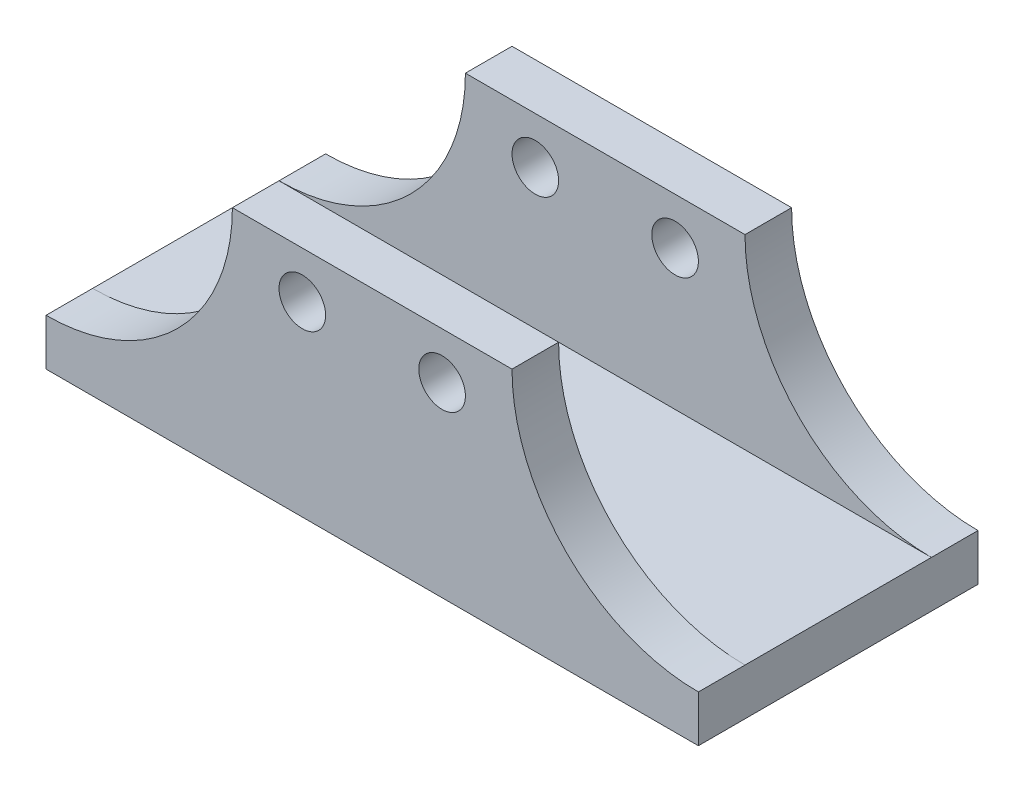
ISO-10303-21;
HEADER;
FILE_DESCRIPTION(('STEP AP214'),'2;1');
FILE_NAME('part.step','',(''),(''),'','','');
FILE_SCHEMA(('AUTOMOTIVE_DESIGN { 1 0 10303 214 1 1 1 1 }'));
ENDSEC;
DATA;
#1=APPLICATION_CONTEXT('core data for automotive mechanical design processes');
#2=APPLICATION_PROTOCOL_DEFINITION('international standard','automotive_design',2000,#1);
#3=PRODUCT_CONTEXT('',#1,'mechanical');
#4=PRODUCT('Part','Part','',(#3));
#5=PRODUCT_RELATED_PRODUCT_CATEGORY('part','',(#4));
#6=PRODUCT_DEFINITION_FORMATION('','',#4);
#7=PRODUCT_DEFINITION_CONTEXT('part definition',#1,'design');
#8=PRODUCT_DEFINITION('design','',#6,#7);
#9=PRODUCT_DEFINITION_SHAPE('','',#8);
#10=(LENGTH_UNIT() NAMED_UNIT(*) SI_UNIT(.MILLI.,.METRE.));
#11=(NAMED_UNIT(*) PLANE_ANGLE_UNIT() SI_UNIT($,.RADIAN.));
#12=(NAMED_UNIT(*) SI_UNIT($,.STERADIAN.) SOLID_ANGLE_UNIT());
#13=UNCERTAINTY_MEASURE_WITH_UNIT(LENGTH_MEASURE(1.E-05),#10,'distance_accuracy_value','');
#14=(GEOMETRIC_REPRESENTATION_CONTEXT(3) GLOBAL_UNCERTAINTY_ASSIGNED_CONTEXT((#13)) GLOBAL_UNIT_ASSIGNED_CONTEXT((#10,
#11,#12)) REPRESENTATION_CONTEXT('',''));
#15=CARTESIAN_POINT('',(0.,0.,0.));
#16=DIRECTION('',(0.,0.,1.));
#17=DIRECTION('',(1.,0.,0.));
#18=AXIS2_PLACEMENT_3D('',#15,#16,#17);
#19=CARTESIAN_POINT('',(-49.1371523651057,43.9225101022106,10.));
#20=DIRECTION('',(0.,0.,1.));
#21=DIRECTION('',(1.,0.,0.));
#22=AXIS2_PLACEMENT_3D('',#19,#20,#21);
#23=PLANE('',#22);
#24=DIRECTION('',(-1.,0.,0.));
#25=VECTOR('',#24,1.);
#26=CARTESIAN_POINT('',(-49.1371523651053,3.9225101022106,10.));
#27=LINE('',#26,#25);
#28=CARTESIAN_POINT('',(90.8628476348943,3.9225101022106,10.));
#29=VERTEX_POINT('',#28);
#30=CARTESIAN_POINT('',(-49.1371523651053,3.9225101022106,10.));
#31=VERTEX_POINT('',#30);
#32=EDGE_CURVE('E83',#29,#31,#27,.T.);
#33=ORIENTED_EDGE('',*,*,#32,.F.);
#34=CARTESIAN_POINT('',(90.8628476348943,43.9225101022106,10.));
#35=DIRECTION('',(0.,0.,-1.));
#36=DIRECTION('',(1.,0.,0.));
#37=AXIS2_PLACEMENT_3D('',#34,#35,#36);
#38=CIRCLE('',#37,40.);
#39=CARTESIAN_POINT('',(50.8628476348943,43.9225101022106,10.));
#40=VERTEX_POINT('',#39);
#41=EDGE_CURVE('E178',#29,#40,#38,.T.);
#42=ORIENTED_EDGE('',*,*,#41,.T.);
#43=DIRECTION('',(-1.,0.,0.));
#44=VECTOR('',#43,1.);
#45=CARTESIAN_POINT('',(-9.13715236510574,43.9225101022106,10.));
#46=LINE('',#45,#44);
#47=CARTESIAN_POINT('',(-9.13715236510574,43.9225101022106,10.));
#48=VERTEX_POINT('',#47);
#49=EDGE_CURVE('E50',#40,#48,#46,.T.);
#50=ORIENTED_EDGE('',*,*,#49,.T.);
#51=CARTESIAN_POINT('',(-49.1371523651057,43.9225101022106,10.));
#52=DIRECTION('',(0.,0.,-1.));
#53=DIRECTION('',(1.,0.,0.));
#54=AXIS2_PLACEMENT_3D('',#51,#52,#53);
#55=CIRCLE('',#54,40.);
#56=EDGE_CURVE('E176',#48,#31,#55,.T.);
#57=ORIENTED_EDGE('',*,*,#56,.T.);
#58=EDGE_LOOP('',(#33,#42,#50,#57));
#59=FACE_BOUND('',#58,.T.);
#60=CARTESIAN_POINT('',(5.86284763489426,33.9225101022106,10.));
#61=DIRECTION('',(0.,0.,1.));
#62=DIRECTION('',(1.,0.,0.));
#63=AXIS2_PLACEMENT_3D('',#60,#61,#62);
#64=CIRCLE('',#63,5.);
#65=CARTESIAN_POINT('',(10.8628476348943,33.9225101022106,10.));
#66=VERTEX_POINT('',#65);
#67=EDGE_CURVE('E170',#66,#66,#64,.T.);
#68=ORIENTED_EDGE('',*,*,#67,.F.);
#69=EDGE_LOOP('',(#68));
#70=FACE_BOUND('',#69,.T.);
#71=CARTESIAN_POINT('',(35.8628476348943,33.9225101022106,10.));
#72=DIRECTION('',(0.,0.,1.));
#73=DIRECTION('',(1.,0.,0.));
#74=AXIS2_PLACEMENT_3D('',#71,#72,#73);
#75=CIRCLE('',#74,5.);
#76=CARTESIAN_POINT('',(40.8628476348943,33.9225101022106,10.));
#77=VERTEX_POINT('',#76);
#78=EDGE_CURVE('E164',#77,#77,#75,.T.);
#79=ORIENTED_EDGE('',*,*,#78,.F.);
#80=EDGE_LOOP('',(#79));
#81=FACE_BOUND('',#80,.T.);
#82=ADVANCED_FACE('F33',(#59,#70,#81),#23,.T.);
#83=CARTESIAN_POINT('',(-49.1371523651057,43.9225101022106,0.));
#84=DIRECTION('',(0.,0.,1.));
#85=DIRECTION('',(1.,0.,0.));
#86=AXIS2_PLACEMENT_3D('',#83,#84,#85);
#87=PLANE('',#86);
#88=CARTESIAN_POINT('',(-49.1371523651057,43.9225101022106,0.));
#89=DIRECTION('',(0.,0.,-1.));
#90=DIRECTION('',(1.,0.,0.));
#91=AXIS2_PLACEMENT_3D('',#88,#89,#90);
#92=CIRCLE('',#91,40.);
#93=CARTESIAN_POINT('',(-9.13715236510574,43.9225101022106,0.));
#94=VERTEX_POINT('',#93);
#95=CARTESIAN_POINT('',(-49.1371523651057,3.9225101022106,0.));
#96=VERTEX_POINT('',#95);
#97=EDGE_CURVE('E173',#94,#96,#92,.T.);
#98=ORIENTED_EDGE('',*,*,#97,.F.);
#99=DIRECTION('',(-1.,0.,0.));
#100=VECTOR('',#99,1.);
#101=CARTESIAN_POINT('',(-9.13715236510574,43.9225101022106,0.));
#102=LINE('',#101,#100);
#103=CARTESIAN_POINT('',(50.8628476348943,43.9225101022106,0.));
#104=VERTEX_POINT('',#103);
#105=EDGE_CURVE('E79',#104,#94,#102,.T.);
#106=ORIENTED_EDGE('',*,*,#105,.F.);
#107=CARTESIAN_POINT('',(90.8628476348943,43.9225101022106,0.));
#108=DIRECTION('',(0.,0.,-1.));
#109=DIRECTION('',(1.,0.,0.));
#110=AXIS2_PLACEMENT_3D('',#107,#108,#109);
#111=CIRCLE('',#110,40.);
#112=CARTESIAN_POINT('',(90.8628476348943,3.9225101022106,0.));
#113=VERTEX_POINT('',#112);
#114=EDGE_CURVE('E74',#113,#104,#111,.T.);
#115=ORIENTED_EDGE('',*,*,#114,.F.);
#116=DIRECTION('',(0.,1.,0.));
#117=VECTOR('',#116,1.);
#118=CARTESIAN_POINT('',(90.8628476348943,-6.0774898977894,0.));
#119=LINE('',#118,#117);
#120=CARTESIAN_POINT('',(90.8628476348943,-6.0774898977894,0.));
#121=VERTEX_POINT('',#120);
#122=EDGE_CURVE('E188',#121,#113,#119,.T.);
#123=ORIENTED_EDGE('',*,*,#122,.F.);
#124=DIRECTION('',(1.,0.,0.));
#125=VECTOR('',#124,1.);
#126=CARTESIAN_POINT('',(-49.1371523651057,-6.0774898977894,0.));
#127=LINE('',#126,#125);
#128=CARTESIAN_POINT('',(-49.1371523651057,-6.0774898977894,0.));
#129=VERTEX_POINT('',#128);
#130=EDGE_CURVE('E186',#129,#121,#127,.T.);
#131=ORIENTED_EDGE('',*,*,#130,.F.);
#132=DIRECTION('',(0.,-1.,0.));
#133=VECTOR('',#132,1.);
#134=CARTESIAN_POINT('',(-49.1371523651057,3.9225101022106,0.));
#135=LINE('',#134,#133);
#136=EDGE_CURVE('E184',#96,#129,#135,.T.);
#137=ORIENTED_EDGE('',*,*,#136,.F.);
#138=EDGE_LOOP('',(#98,#106,#115,#123,#131,#137));
#139=FACE_BOUND('',#138,.T.);
#140=CARTESIAN_POINT('',(5.86284763489426,33.9225101022106,0.));
#141=DIRECTION('',(0.,0.,1.));
#142=DIRECTION('',(1.,0.,0.));
#143=AXIS2_PLACEMENT_3D('',#140,#141,#142);
#144=CIRCLE('',#143,5.);
#145=CARTESIAN_POINT('',(10.8628476348943,33.9225101022106,0.));
#146=VERTEX_POINT('',#145);
#147=EDGE_CURVE('E167',#146,#146,#144,.T.);
#148=ORIENTED_EDGE('',*,*,#147,.T.);
#149=EDGE_LOOP('',(#148));
#150=FACE_BOUND('',#149,.T.);
#151=CARTESIAN_POINT('',(35.8628476348943,33.9225101022106,0.));
#152=DIRECTION('',(0.,0.,1.));
#153=DIRECTION('',(1.,0.,0.));
#154=AXIS2_PLACEMENT_3D('',#151,#152,#153);
#155=CIRCLE('',#154,5.);
#156=CARTESIAN_POINT('',(40.8628476348943,33.9225101022106,0.));
#157=VERTEX_POINT('',#156);
#158=EDGE_CURVE('E163',#157,#157,#155,.T.);
#159=ORIENTED_EDGE('',*,*,#158,.T.);
#160=EDGE_LOOP('',(#159));
#161=FACE_BOUND('',#160,.T.);
#162=ADVANCED_FACE('F205',(#139,#150,#161),#87,.F.);
#163=CARTESIAN_POINT('',(-49.1371523651057,43.9225101022106,10.));
#164=DIRECTION('',(0.,0.,-1.));
#165=DIRECTION('',(-1.,0.,0.));
#166=AXIS2_PLACEMENT_3D('',#163,#164,#165);
#167=CYLINDRICAL_SURFACE('',#166,40.);
#168=ORIENTED_EDGE('',*,*,#97,.T.);
#169=DIRECTION('',(0.,0.,-1.));
#170=VECTOR('',#169,1.);
#171=CARTESIAN_POINT('',(-49.1371523651057,3.9225101022106,10.));
#172=LINE('',#171,#170);
#173=EDGE_CURVE('E11',#31,#96,#172,.T.);
#174=ORIENTED_EDGE('',*,*,#173,.F.);
#175=ORIENTED_EDGE('',*,*,#56,.F.);
#176=DIRECTION('',(0.,0.,-1.));
#177=VECTOR('',#176,1.);
#178=CARTESIAN_POINT('',(-9.13715236510574,43.9225101022106,10.));
#179=LINE('',#178,#177);
#180=EDGE_CURVE('E181',#48,#94,#179,.T.);
#181=ORIENTED_EDGE('',*,*,#180,.T.);
#182=EDGE_LOOP('',(#168,#174,#175,#181));
#183=FACE_BOUND('',#182,.T.);
#184=ADVANCED_FACE('F35',(#183),#167,.F.);
#185=CARTESIAN_POINT('',(-49.1371523651057,3.9225101022106,10.));
#186=DIRECTION('',(1.,0.,0.));
#187=DIRECTION('',(0.,0.,-1.));
#188=AXIS2_PLACEMENT_3D('',#185,#186,#187);
#189=PLANE('',#188);
#190=ORIENTED_EDGE('',*,*,#136,.T.);
#191=DIRECTION('',(0.,0.,-1.));
#192=VECTOR('',#191,1.);
#193=CARTESIAN_POINT('',(-49.1371523651057,-6.0774898977894,10.));
#194=LINE('',#193,#192);
#195=CARTESIAN_POINT('',(-49.1371523651057,-6.0774898977894,60.));
#196=VERTEX_POINT('',#195);
#197=EDGE_CURVE('E42',#196,#129,#194,.T.);
#198=ORIENTED_EDGE('',*,*,#197,.F.);
#199=DIRECTION('',(0.,-1.,0.));
#200=VECTOR('',#199,1.);
#201=CARTESIAN_POINT('',(-49.1371523651053,3.9225101022106,60.));
#202=LINE('',#201,#200);
#203=CARTESIAN_POINT('',(-49.1371523651053,3.9225101022106,60.));
#204=VERTEX_POINT('',#203);
#205=EDGE_CURVE('E120',#204,#196,#202,.T.);
#206=ORIENTED_EDGE('',*,*,#205,.F.);
#207=DIRECTION('',(0.,0.,-1.));
#208=VECTOR('',#207,1.);
#209=CARTESIAN_POINT('',(-49.1371523651053,3.9225101022106,60.));
#210=LINE('',#209,#208);
#211=CARTESIAN_POINT('',(-49.1371523651053,3.9225101022106,50.));
#212=VERTEX_POINT('',#211);
#213=EDGE_CURVE('E125',#204,#212,#210,.T.);
#214=ORIENTED_EDGE('',*,*,#213,.T.);
#215=DIRECTION('',(0.,0.,-1.));
#216=VECTOR('',#215,1.);
#217=CARTESIAN_POINT('',(-49.1371523651053,3.9225101022106,50.));
#218=LINE('',#217,#216);
#219=EDGE_CURVE('E157',#212,#31,#218,.T.);
#220=ORIENTED_EDGE('',*,*,#219,.T.);
#221=ORIENTED_EDGE('',*,*,#173,.T.);
#222=EDGE_LOOP('',(#190,#198,#206,#214,#220,#221));
#223=FACE_BOUND('',#222,.T.);
#224=ADVANCED_FACE('F122',(#223),#189,.F.);
#225=CARTESIAN_POINT('',(-49.1371523651057,-6.0774898977894,10.));
#226=DIRECTION('',(0.,1.,0.));
#227=DIRECTION('',(0.,0.,1.));
#228=AXIS2_PLACEMENT_3D('',#225,#226,#227);
#229=PLANE('',#228);
#230=CARTESIAN_POINT('',(20.8628476348943,-6.0774898977894,30.));
#231=DIRECTION('',(0.,1.,0.));
#232=DIRECTION('',(0.,0.,1.));
#233=AXIS2_PLACEMENT_3D('',#230,#231,#232);
#234=CIRCLE('',#233,5.);
#235=CARTESIAN_POINT('',(20.8628476348943,-6.0774898977894,35.));
#236=VERTEX_POINT('',#235);
#237=EDGE_CURVE('E441',#236,#236,#234,.T.);
#238=ORIENTED_EDGE('',*,*,#237,.T.);
#239=EDGE_LOOP('',(#238));
#240=FACE_BOUND('',#239,.T.);
#241=ORIENTED_EDGE('',*,*,#130,.T.);
#242=DIRECTION('',(0.,0.,-1.));
#243=VECTOR('',#242,1.);
#244=CARTESIAN_POINT('',(90.8628476348943,-6.0774898977894,10.));
#245=LINE('',#244,#243);
#246=CARTESIAN_POINT('',(90.8628476348943,-6.0774898977894,60.));
#247=VERTEX_POINT('',#246);
#248=EDGE_CURVE('E197',#247,#121,#245,.T.);
#249=ORIENTED_EDGE('',*,*,#248,.F.);
#250=DIRECTION('',(1.,0.,0.));
#251=VECTOR('',#250,1.);
#252=CARTESIAN_POINT('',(-49.1371523651057,-6.0774898977894,60.));
#253=LINE('',#252,#251);
#254=EDGE_CURVE('E131',#196,#247,#253,.T.);
#255=ORIENTED_EDGE('',*,*,#254,.F.);
#256=ORIENTED_EDGE('',*,*,#197,.T.);
#257=EDGE_LOOP('',(#241,#249,#255,#256));
#258=FACE_BOUND('',#257,.T.);
#259=ADVANCED_FACE('F201',(#240,#258),#229,.F.);
#260=CARTESIAN_POINT('',(90.8628476348943,-6.0774898977894,10.));
#261=DIRECTION('',(-1.,0.,0.));
#262=DIRECTION('',(0.,0.,1.));
#263=AXIS2_PLACEMENT_3D('',#260,#261,#262);
#264=PLANE('',#263);
#265=ORIENTED_EDGE('',*,*,#122,.T.);
#266=DIRECTION('',(0.,0.,-1.));
#267=VECTOR('',#266,1.);
#268=CARTESIAN_POINT('',(90.8628476348943,3.9225101022106,10.));
#269=LINE('',#268,#267);
#270=EDGE_CURVE('E195',#29,#113,#269,.T.);
#271=ORIENTED_EDGE('',*,*,#270,.F.);
#272=DIRECTION('',(0.,0.,-1.));
#273=VECTOR('',#272,1.);
#274=CARTESIAN_POINT('',(90.8628476348943,3.9225101022106,50.));
#275=LINE('',#274,#273);
#276=CARTESIAN_POINT('',(90.8628476348943,3.9225101022106,50.));
#277=VERTEX_POINT('',#276);
#278=EDGE_CURVE('E160',#277,#29,#275,.T.);
#279=ORIENTED_EDGE('',*,*,#278,.F.);
#280=DIRECTION('',(0.,0.,-1.));
#281=VECTOR('',#280,1.);
#282=CARTESIAN_POINT('',(90.8628476348943,3.9225101022106,60.));
#283=LINE('',#282,#281);
#284=CARTESIAN_POINT('',(90.8628476348943,3.9225101022106,60.));
#285=VERTEX_POINT('',#284);
#286=EDGE_CURVE('E147',#285,#277,#283,.T.);
#287=ORIENTED_EDGE('',*,*,#286,.F.);
#288=DIRECTION('',(0.,1.,0.));
#289=VECTOR('',#288,1.);
#290=CARTESIAN_POINT('',(90.8628476348943,-6.0774898977894,60.));
#291=LINE('',#290,#289);
#292=EDGE_CURVE('E217',#247,#285,#291,.T.);
#293=ORIENTED_EDGE('',*,*,#292,.F.);
#294=ORIENTED_EDGE('',*,*,#248,.T.);
#295=EDGE_LOOP('',(#265,#271,#279,#287,#293,#294));
#296=FACE_BOUND('',#295,.T.);
#297=ADVANCED_FACE('F208',(#296),#264,.F.);
#298=CARTESIAN_POINT('',(90.8628476348943,43.9225101022106,10.));
#299=DIRECTION('',(0.,0.,-1.));
#300=DIRECTION('',(-1.,0.,0.));
#301=AXIS2_PLACEMENT_3D('',#298,#299,#300);
#302=CYLINDRICAL_SURFACE('',#301,40.);
#303=ORIENTED_EDGE('',*,*,#114,.T.);
#304=DIRECTION('',(0.,0.,-1.));
#305=VECTOR('',#304,1.);
#306=CARTESIAN_POINT('',(50.8628476348943,43.9225101022106,10.));
#307=LINE('',#306,#305);
#308=EDGE_CURVE('E193',#40,#104,#307,.T.);
#309=ORIENTED_EDGE('',*,*,#308,.F.);
#310=ORIENTED_EDGE('',*,*,#41,.F.);
#311=ORIENTED_EDGE('',*,*,#270,.T.);
#312=EDGE_LOOP('',(#303,#309,#310,#311));
#313=FACE_BOUND('',#312,.T.);
#314=ADVANCED_FACE('F211',(#313),#302,.F.);
#315=CARTESIAN_POINT('',(-9.13715236510574,43.9225101022106,10.));
#316=DIRECTION('',(0.,-1.,0.));
#317=DIRECTION('',(0.,0.,-1.));
#318=AXIS2_PLACEMENT_3D('',#315,#316,#317);
#319=PLANE('',#318);
#320=ORIENTED_EDGE('',*,*,#105,.T.);
#321=ORIENTED_EDGE('',*,*,#180,.F.);
#322=ORIENTED_EDGE('',*,*,#49,.F.);
#323=ORIENTED_EDGE('',*,*,#308,.T.);
#324=EDGE_LOOP('',(#320,#321,#322,#323));
#325=FACE_BOUND('',#324,.T.);
#326=ADVANCED_FACE('F267',(#325),#319,.F.);
#327=CARTESIAN_POINT('',(5.86284763489426,33.9225101022106,10.));
#328=DIRECTION('',(0.,0.,-1.));
#329=DIRECTION('',(-1.,0.,0.));
#330=AXIS2_PLACEMENT_3D('',#327,#328,#329);
#331=CYLINDRICAL_SURFACE('',#330,5.);
#332=ORIENTED_EDGE('',*,*,#67,.T.);
#333=EDGE_LOOP('',(#332));
#334=FACE_BOUND('',#333,.T.);
#335=ORIENTED_EDGE('',*,*,#147,.F.);
#336=EDGE_LOOP('',(#335));
#337=FACE_BOUND('',#336,.T.);
#338=ADVANCED_FACE('F264',(#334,#337),#331,.F.);
#339=CARTESIAN_POINT('',(35.8628476348943,33.9225101022106,10.));
#340=DIRECTION('',(0.,0.,-1.));
#341=DIRECTION('',(-1.,0.,0.));
#342=AXIS2_PLACEMENT_3D('',#339,#340,#341);
#343=CYLINDRICAL_SURFACE('',#342,5.);
#344=ORIENTED_EDGE('',*,*,#78,.T.);
#345=EDGE_LOOP('',(#344));
#346=FACE_BOUND('',#345,.T.);
#347=ORIENTED_EDGE('',*,*,#158,.F.);
#348=EDGE_LOOP('',(#347));
#349=FACE_BOUND('',#348,.T.);
#350=ADVANCED_FACE('F250',(#346,#349),#343,.F.);
#351=CARTESIAN_POINT('',(-49.1371523651053,3.9225101022106,50.));
#352=DIRECTION('',(0.,-1.,0.));
#353=DIRECTION('',(0.,0.,-1.));
#354=AXIS2_PLACEMENT_3D('',#351,#352,#353);
#355=PLANE('',#354);
#356=CARTESIAN_POINT('',(20.8628476348943,3.9225101022106,30.));
#357=DIRECTION('',(0.,1.,0.));
#358=DIRECTION('',(0.,0.,1.));
#359=AXIS2_PLACEMENT_3D('',#356,#357,#358);
#360=CIRCLE('',#359,5.);
#361=CARTESIAN_POINT('',(20.8628476348943,3.9225101022106,35.));
#362=VERTEX_POINT('',#361);
#363=EDGE_CURVE('E443',#362,#362,#360,.T.);
#364=ORIENTED_EDGE('',*,*,#363,.F.);
#365=EDGE_LOOP('',(#364));
#366=FACE_BOUND('',#365,.T.);
#367=ORIENTED_EDGE('',*,*,#32,.T.);
#368=ORIENTED_EDGE('',*,*,#219,.F.);
#369=DIRECTION('',(-1.,0.,0.));
#370=VECTOR('',#369,1.);
#371=CARTESIAN_POINT('',(-49.1371523651053,3.9225101022106,50.));
#372=LINE('',#371,#370);
#373=EDGE_CURVE('E149',#277,#212,#372,.T.);
#374=ORIENTED_EDGE('',*,*,#373,.F.);
#375=ORIENTED_EDGE('',*,*,#278,.T.);
#376=EDGE_LOOP('',(#367,#368,#374,#375));
#377=FACE_BOUND('',#376,.T.);
#378=ADVANCED_FACE('F214',(#366,#377),#355,.F.);
#379=CARTESIAN_POINT('',(-49.1371523651053,43.9225101022106,50.));
#380=DIRECTION('',(0.,0.,1.));
#381=DIRECTION('',(1.,0.,0.));
#382=AXIS2_PLACEMENT_3D('',#379,#380,#381);
#383=PLANE('',#382);
#384=CARTESIAN_POINT('',(5.86284763489426,33.9225101022106,50.));
#385=DIRECTION('',(0.,0.,1.));
#386=DIRECTION('',(1.,0.,0.));
#387=AXIS2_PLACEMENT_3D('',#384,#385,#386);
#388=CIRCLE('',#387,5.);
#389=CARTESIAN_POINT('',(10.8628476348943,33.9225101022106,50.));
#390=VERTEX_POINT('',#389);
#391=EDGE_CURVE('E432',#390,#390,#388,.T.);
#392=ORIENTED_EDGE('',*,*,#391,.T.);
#393=EDGE_LOOP('',(#392));
#394=FACE_BOUND('',#393,.T.);
#395=CARTESIAN_POINT('',(35.8628476348943,33.9225101022106,50.));
#396=DIRECTION('',(0.,0.,1.));
#397=DIRECTION('',(1.,0.,0.));
#398=AXIS2_PLACEMENT_3D('',#395,#396,#397);
#399=CIRCLE('',#398,5.);
#400=CARTESIAN_POINT('',(40.8628476348943,33.9225101022106,50.));
#401=VERTEX_POINT('',#400);
#402=EDGE_CURVE('E437',#401,#401,#399,.T.);
#403=ORIENTED_EDGE('',*,*,#402,.T.);
#404=EDGE_LOOP('',(#403));
#405=FACE_BOUND('',#404,.T.);
#406=CARTESIAN_POINT('',(90.8628476348943,43.9225101022106,50.));
#407=DIRECTION('',(0.,0.,-1.));
#408=DIRECTION('',(1.,0.,0.));
#409=AXIS2_PLACEMENT_3D('',#406,#407,#408);
#410=CIRCLE('',#409,40.);
#411=CARTESIAN_POINT('',(50.8628476348943,43.9225101022106,50.));
#412=VERTEX_POINT('',#411);
#413=EDGE_CURVE('E231',#277,#412,#410,.T.);
#414=ORIENTED_EDGE('',*,*,#413,.F.);
#415=ORIENTED_EDGE('',*,*,#373,.T.);
#416=CARTESIAN_POINT('',(-49.1371523651053,43.9225101022106,50.));
#417=DIRECTION('',(0.,0.,-1.));
#418=DIRECTION('',(1.,0.,0.));
#419=AXIS2_PLACEMENT_3D('',#416,#417,#418);
#420=CIRCLE('',#419,40.);
#421=CARTESIAN_POINT('',(-9.13715236510532,43.9225101022106,50.));
#422=VERTEX_POINT('',#421);
#423=EDGE_CURVE('E146',#422,#212,#420,.T.);
#424=ORIENTED_EDGE('',*,*,#423,.F.);
#425=DIRECTION('',(-1.,0.,0.));
#426=VECTOR('',#425,1.);
#427=CARTESIAN_POINT('',(-9.13715236510532,43.9225101022106,50.));
#428=LINE('',#427,#426);
#429=EDGE_CURVE('E142',#412,#422,#428,.T.);
#430=ORIENTED_EDGE('',*,*,#429,.F.);
#431=EDGE_LOOP('',(#414,#415,#424,#430));
#432=FACE_BOUND('',#431,.T.);
#433=ADVANCED_FACE('F239',(#394,#405,#432),#383,.F.);
#434=CARTESIAN_POINT('',(-49.1371523651053,43.9225101022106,60.));
#435=DIRECTION('',(0.,0.,1.));
#436=DIRECTION('',(1.,0.,0.));
#437=AXIS2_PLACEMENT_3D('',#434,#435,#436);
#438=PLANE('',#437);
#439=CARTESIAN_POINT('',(5.86284763489426,33.9225101022106,60.));
#440=DIRECTION('',(0.,0.,1.));
#441=DIRECTION('',(1.,0.,0.));
#442=AXIS2_PLACEMENT_3D('',#439,#440,#441);
#443=CIRCLE('',#442,5.);
#444=CARTESIAN_POINT('',(10.8628476348943,33.9225101022106,60.));
#445=VERTEX_POINT('',#444);
#446=EDGE_CURVE('E232',#445,#445,#443,.T.);
#447=ORIENTED_EDGE('',*,*,#446,.F.);
#448=EDGE_LOOP('',(#447));
#449=FACE_BOUND('',#448,.T.);
#450=CARTESIAN_POINT('',(-49.1371523651053,43.9225101022106,60.));
#451=DIRECTION('',(0.,0.,-1.));
#452=DIRECTION('',(1.,0.,0.));
#453=AXIS2_PLACEMENT_3D('',#450,#451,#452);
#454=CIRCLE('',#453,40.);
#455=CARTESIAN_POINT('',(-9.13715236510532,43.9225101022106,60.));
#456=VERTEX_POINT('',#455);
#457=EDGE_CURVE('E132',#456,#204,#454,.T.);
#458=ORIENTED_EDGE('',*,*,#457,.T.);
#459=ORIENTED_EDGE('',*,*,#205,.T.);
#460=ORIENTED_EDGE('',*,*,#254,.T.);
#461=ORIENTED_EDGE('',*,*,#292,.T.);
#462=CARTESIAN_POINT('',(90.8628476348943,43.9225101022106,60.));
#463=DIRECTION('',(0.,0.,-1.));
#464=DIRECTION('',(1.,0.,0.));
#465=AXIS2_PLACEMENT_3D('',#462,#463,#464);
#466=CIRCLE('',#465,40.);
#467=CARTESIAN_POINT('',(50.8628476348943,43.9225101022106,60.));
#468=VERTEX_POINT('',#467);
#469=EDGE_CURVE('E221',#285,#468,#466,.T.);
#470=ORIENTED_EDGE('',*,*,#469,.T.);
#471=DIRECTION('',(-1.,0.,0.));
#472=VECTOR('',#471,1.);
#473=CARTESIAN_POINT('',(-9.13715236510532,43.9225101022106,60.));
#474=LINE('',#473,#472);
#475=EDGE_CURVE('E138',#468,#456,#474,.T.);
#476=ORIENTED_EDGE('',*,*,#475,.T.);
#477=EDGE_LOOP('',(#458,#459,#460,#461,#470,#476));
#478=FACE_BOUND('',#477,.T.);
#479=CARTESIAN_POINT('',(35.8628476348943,33.9225101022106,60.));
#480=DIRECTION('',(0.,0.,1.));
#481=DIRECTION('',(1.,0.,0.));
#482=AXIS2_PLACEMENT_3D('',#479,#480,#481);
#483=CIRCLE('',#482,5.);
#484=CARTESIAN_POINT('',(40.8628476348943,33.9225101022106,60.));
#485=VERTEX_POINT('',#484);
#486=EDGE_CURVE('E433',#485,#485,#483,.T.);
#487=ORIENTED_EDGE('',*,*,#486,.F.);
#488=EDGE_LOOP('',(#487));
#489=FACE_BOUND('',#488,.T.);
#490=ADVANCED_FACE('F135',(#449,#478,#489),#438,.T.);
#491=CARTESIAN_POINT('',(-49.1371523651053,43.9225101022106,60.));
#492=DIRECTION('',(0.,0.,-1.));
#493=DIRECTION('',(-1.,0.,0.));
#494=AXIS2_PLACEMENT_3D('',#491,#492,#493);
#495=CYLINDRICAL_SURFACE('',#494,40.);
#496=ORIENTED_EDGE('',*,*,#423,.T.);
#497=ORIENTED_EDGE('',*,*,#213,.F.);
#498=ORIENTED_EDGE('',*,*,#457,.F.);
#499=DIRECTION('',(0.,0.,-1.));
#500=VECTOR('',#499,1.);
#501=CARTESIAN_POINT('',(-9.13715236510532,43.9225101022106,60.));
#502=LINE('',#501,#500);
#503=EDGE_CURVE('E225',#456,#422,#502,.T.);
#504=ORIENTED_EDGE('',*,*,#503,.T.);
#505=EDGE_LOOP('',(#496,#497,#498,#504));
#506=FACE_BOUND('',#505,.T.);
#507=ADVANCED_FACE('F144',(#506),#495,.F.);
#508=CARTESIAN_POINT('',(90.8628476348943,43.9225101022106,60.));
#509=DIRECTION('',(0.,0.,-1.));
#510=DIRECTION('',(-1.,0.,0.));
#511=AXIS2_PLACEMENT_3D('',#508,#509,#510);
#512=CYLINDRICAL_SURFACE('',#511,40.);
#513=ORIENTED_EDGE('',*,*,#413,.T.);
#514=DIRECTION('',(0.,0.,-1.));
#515=VECTOR('',#514,1.);
#516=CARTESIAN_POINT('',(50.8628476348943,43.9225101022106,60.));
#517=LINE('',#516,#515);
#518=EDGE_CURVE('E152',#468,#412,#517,.T.);
#519=ORIENTED_EDGE('',*,*,#518,.F.);
#520=ORIENTED_EDGE('',*,*,#469,.F.);
#521=ORIENTED_EDGE('',*,*,#286,.T.);
#522=EDGE_LOOP('',(#513,#519,#520,#521));
#523=FACE_BOUND('',#522,.T.);
#524=ADVANCED_FACE('F222',(#523),#512,.F.);
#525=CARTESIAN_POINT('',(-9.13715236510532,43.9225101022106,60.));
#526=DIRECTION('',(0.,-1.,0.));
#527=DIRECTION('',(0.,0.,-1.));
#528=AXIS2_PLACEMENT_3D('',#525,#526,#527);
#529=PLANE('',#528);
#530=ORIENTED_EDGE('',*,*,#429,.T.);
#531=ORIENTED_EDGE('',*,*,#503,.F.);
#532=ORIENTED_EDGE('',*,*,#475,.F.);
#533=ORIENTED_EDGE('',*,*,#518,.T.);
#534=EDGE_LOOP('',(#530,#531,#532,#533));
#535=FACE_BOUND('',#534,.T.);
#536=ADVANCED_FACE('F237',(#535),#529,.F.);
#537=CARTESIAN_POINT('',(5.86284763489426,33.9225101022106,60.));
#538=DIRECTION('',(0.,0.,-1.));
#539=DIRECTION('',(-1.,0.,0.));
#540=AXIS2_PLACEMENT_3D('',#537,#538,#539);
#541=CYLINDRICAL_SURFACE('',#540,5.);
#542=ORIENTED_EDGE('',*,*,#446,.T.);
#543=EDGE_LOOP('',(#542));
#544=FACE_BOUND('',#543,.T.);
#545=ORIENTED_EDGE('',*,*,#391,.F.);
#546=EDGE_LOOP('',(#545));
#547=FACE_BOUND('',#546,.T.);
#548=ADVANCED_FACE('F368',(#544,#547),#541,.F.);
#549=CARTESIAN_POINT('',(35.8628476348943,33.9225101022106,60.));
#550=DIRECTION('',(0.,0.,-1.));
#551=DIRECTION('',(-1.,0.,0.));
#552=AXIS2_PLACEMENT_3D('',#549,#550,#551);
#553=CYLINDRICAL_SURFACE('',#552,5.);
#554=ORIENTED_EDGE('',*,*,#486,.T.);
#555=EDGE_LOOP('',(#554));
#556=FACE_BOUND('',#555,.T.);
#557=ORIENTED_EDGE('',*,*,#402,.F.);
#558=EDGE_LOOP('',(#557));
#559=FACE_BOUND('',#558,.T.);
#560=ADVANCED_FACE('F358',(#556,#559),#553,.F.);
#561=CARTESIAN_POINT('',(20.8628476348943,-6.0774898977894,30.));
#562=DIRECTION('',(0.,1.,0.));
#563=DIRECTION('',(0.,0.,1.));
#564=AXIS2_PLACEMENT_3D('',#561,#562,#563);
#565=CYLINDRICAL_SURFACE('',#564,5.);
#566=ORIENTED_EDGE('',*,*,#237,.F.);
#567=EDGE_LOOP('',(#566));
#568=FACE_BOUND('',#567,.T.);
#569=ORIENTED_EDGE('',*,*,#363,.T.);
#570=EDGE_LOOP('',(#569));
#571=FACE_BOUND('',#570,.T.);
#572=ADVANCED_FACE('F354',(#568,#571),#565,.F.);
#573=CLOSED_SHELL('',(#82,#162,#184,#224,#259,#297,#314,#326,#338,#350,#378,#433,#490,#507,#524,
#536,#548,#560,#572));
#574=MANIFOLD_SOLID_BREP('B2',#573);
#575=ADVANCED_BREP_SHAPE_REPRESENTATION('',(#18,#574),#14);
#576=SHAPE_DEFINITION_REPRESENTATION(#9,#575);
ENDSEC;
END-ISO-10303-21;
